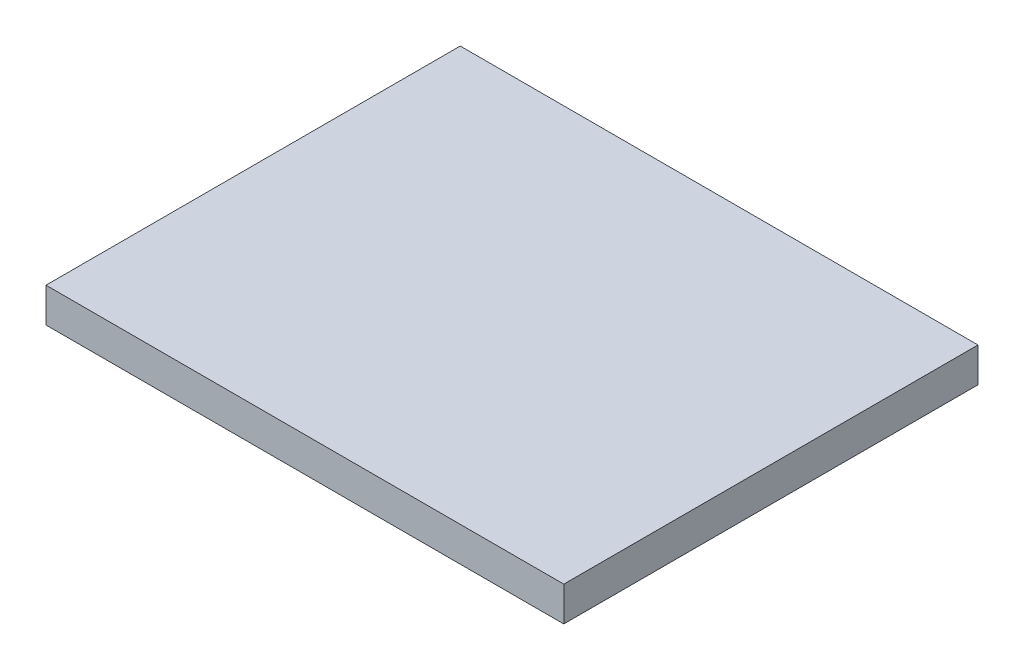
ISO-10303-21;
HEADER;
FILE_DESCRIPTION(('STEP AP214'),'2;1');
FILE_NAME('part.step','',(''),(''),'','','');
FILE_SCHEMA(('AUTOMOTIVE_DESIGN { 1 0 10303 214 1 1 1 1 }'));
ENDSEC;
DATA;
#1=APPLICATION_CONTEXT('core data for automotive mechanical design processes');
#2=APPLICATION_PROTOCOL_DEFINITION('international standard','automotive_design',2000,#1);
#3=PRODUCT_CONTEXT('',#1,'mechanical');
#4=PRODUCT('Part','Part','',(#3));
#5=PRODUCT_RELATED_PRODUCT_CATEGORY('part','',(#4));
#6=PRODUCT_DEFINITION_FORMATION('','',#4);
#7=PRODUCT_DEFINITION_CONTEXT('part definition',#1,'design');
#8=PRODUCT_DEFINITION('design','',#6,#7);
#9=PRODUCT_DEFINITION_SHAPE('','',#8);
#10=(LENGTH_UNIT() NAMED_UNIT(*) SI_UNIT(.MILLI.,.METRE.));
#11=(NAMED_UNIT(*) PLANE_ANGLE_UNIT() SI_UNIT($,.RADIAN.));
#12=(NAMED_UNIT(*) SI_UNIT($,.STERADIAN.) SOLID_ANGLE_UNIT());
#13=UNCERTAINTY_MEASURE_WITH_UNIT(LENGTH_MEASURE(1.E-05),#10,'distance_accuracy_value','');
#14=(GEOMETRIC_REPRESENTATION_CONTEXT(3) GLOBAL_UNCERTAINTY_ASSIGNED_CONTEXT((#13)) GLOBAL_UNIT_ASSIGNED_CONTEXT((#10,
#11,#12)) REPRESENTATION_CONTEXT('',''));
#15=CARTESIAN_POINT('',(0.,0.,0.));
#16=DIRECTION('',(0.,0.,1.));
#17=DIRECTION('',(1.,0.,0.));
#18=AXIS2_PLACEMENT_3D('',#15,#16,#17);
#19=CARTESIAN_POINT('',(47.625,3.175,-38.1));
#20=DIRECTION('',(-1.,0.,0.));
#21=DIRECTION('',(0.,0.,1.));
#22=AXIS2_PLACEMENT_3D('',#19,#20,#21);
#23=PLANE('',#22);
#24=DIRECTION('',(0.,0.,-1.));
#25=VECTOR('',#24,1.);
#26=CARTESIAN_POINT('',(47.625,-3.175,-38.1));
#27=LINE('',#26,#25);
#28=CARTESIAN_POINT('',(47.625,-3.175,38.1));
#29=VERTEX_POINT('',#28);
#30=CARTESIAN_POINT('',(47.625,-3.175,-38.1));
#31=VERTEX_POINT('',#30);
#32=EDGE_CURVE('E96',#29,#31,#27,.T.);
#33=ORIENTED_EDGE('',*,*,#32,.T.);
#34=DIRECTION('',(0.,-1.,0.));
#35=VECTOR('',#34,1.);
#36=CARTESIAN_POINT('',(47.625,3.175,-38.1));
#37=LINE('',#36,#35);
#38=CARTESIAN_POINT('',(47.625,3.175,-38.1));
#39=VERTEX_POINT('',#38);
#40=EDGE_CURVE('E11',#39,#31,#37,.T.);
#41=ORIENTED_EDGE('',*,*,#40,.F.);
#42=DIRECTION('',(0.,0.,-1.));
#43=VECTOR('',#42,1.);
#44=CARTESIAN_POINT('',(47.625,3.175,-38.1));
#45=LINE('',#44,#43);
#46=CARTESIAN_POINT('',(47.625,3.175,38.1));
#47=VERTEX_POINT('',#46);
#48=EDGE_CURVE('E84',#47,#39,#45,.T.);
#49=ORIENTED_EDGE('',*,*,#48,.F.);
#50=DIRECTION('',(0.,-1.,0.));
#51=VECTOR('',#50,1.);
#52=CARTESIAN_POINT('',(47.625,3.175,38.1));
#53=LINE('',#52,#51);
#54=EDGE_CURVE('E92',#47,#29,#53,.T.);
#55=ORIENTED_EDGE('',*,*,#54,.T.);
#56=EDGE_LOOP('',(#33,#41,#49,#55));
#57=FACE_BOUND('',#56,.T.);
#58=ADVANCED_FACE('F33',(#57),#23,.F.);
#59=CARTESIAN_POINT('',(-47.625,3.175,-38.1));
#60=DIRECTION('',(0.,0.,1.));
#61=DIRECTION('',(1.,0.,0.));
#62=AXIS2_PLACEMENT_3D('',#59,#60,#61);
#63=PLANE('',#62);
#64=DIRECTION('',(-1.,0.,0.));
#65=VECTOR('',#64,1.);
#66=CARTESIAN_POINT('',(-47.625,-3.175,-38.1));
#67=LINE('',#66,#65);
#68=CARTESIAN_POINT('',(-47.625,-3.175,-38.1));
#69=VERTEX_POINT('',#68);
#70=EDGE_CURVE('E88',#31,#69,#67,.T.);
#71=ORIENTED_EDGE('',*,*,#70,.T.);
#72=DIRECTION('',(0.,-1.,0.));
#73=VECTOR('',#72,1.);
#74=CARTESIAN_POINT('',(-47.625,3.175,-38.1));
#75=LINE('',#74,#73);
#76=CARTESIAN_POINT('',(-47.625,3.175,-38.1));
#77=VERTEX_POINT('',#76);
#78=EDGE_CURVE('E41',#77,#69,#75,.T.);
#79=ORIENTED_EDGE('',*,*,#78,.F.);
#80=DIRECTION('',(-1.,0.,0.));
#81=VECTOR('',#80,1.);
#82=CARTESIAN_POINT('',(-47.625,3.175,-38.1));
#83=LINE('',#82,#81);
#84=EDGE_CURVE('E79',#39,#77,#83,.T.);
#85=ORIENTED_EDGE('',*,*,#84,.F.);
#86=ORIENTED_EDGE('',*,*,#40,.T.);
#87=EDGE_LOOP('',(#71,#79,#85,#86));
#88=FACE_BOUND('',#87,.T.);
#89=ADVANCED_FACE('F87',(#88),#63,.F.);
#90=CARTESIAN_POINT('',(-47.625,3.175,-38.1));
#91=DIRECTION('',(1.,0.,0.));
#92=DIRECTION('',(0.,0.,-1.));
#93=AXIS2_PLACEMENT_3D('',#90,#91,#92);
#94=PLANE('',#93);
#95=DIRECTION('',(0.,0.,1.));
#96=VECTOR('',#95,1.);
#97=CARTESIAN_POINT('',(-47.625,-3.175,-38.1));
#98=LINE('',#97,#96);
#99=CARTESIAN_POINT('',(-47.625,-3.175,38.1));
#100=VERTEX_POINT('',#99);
#101=EDGE_CURVE('E66',#69,#100,#98,.T.);
#102=ORIENTED_EDGE('',*,*,#101,.T.);
#103=DIRECTION('',(0.,-1.,0.));
#104=VECTOR('',#103,1.);
#105=CARTESIAN_POINT('',(-47.625,3.175,38.1));
#106=LINE('',#105,#104);
#107=CARTESIAN_POINT('',(-47.625,3.175,38.1));
#108=VERTEX_POINT('',#107);
#109=EDGE_CURVE('E89',#108,#100,#106,.T.);
#110=ORIENTED_EDGE('',*,*,#109,.F.);
#111=DIRECTION('',(0.,0.,1.));
#112=VECTOR('',#111,1.);
#113=CARTESIAN_POINT('',(-47.625,3.175,-38.1));
#114=LINE('',#113,#112);
#115=EDGE_CURVE('E82',#77,#108,#114,.T.);
#116=ORIENTED_EDGE('',*,*,#115,.F.);
#117=ORIENTED_EDGE('',*,*,#78,.T.);
#118=EDGE_LOOP('',(#102,#110,#116,#117));
#119=FACE_BOUND('',#118,.T.);
#120=ADVANCED_FACE('F90',(#119),#94,.F.);
#121=CARTESIAN_POINT('',(-47.625,3.175,38.1));
#122=DIRECTION('',(0.,0.,-1.));
#123=DIRECTION('',(-1.,0.,0.));
#124=AXIS2_PLACEMENT_3D('',#121,#122,#123);
#125=PLANE('',#124);
#126=DIRECTION('',(1.,0.,0.));
#127=VECTOR('',#126,1.);
#128=CARTESIAN_POINT('',(-47.625,-3.175,38.1));
#129=LINE('',#128,#127);
#130=EDGE_CURVE('E72',#100,#29,#129,.T.);
#131=ORIENTED_EDGE('',*,*,#130,.T.);
#132=ORIENTED_EDGE('',*,*,#54,.F.);
#133=DIRECTION('',(1.,0.,0.));
#134=VECTOR('',#133,1.);
#135=CARTESIAN_POINT('',(-47.625,3.175,38.1));
#136=LINE('',#135,#134);
#137=EDGE_CURVE('E49',#108,#47,#136,.T.);
#138=ORIENTED_EDGE('',*,*,#137,.F.);
#139=ORIENTED_EDGE('',*,*,#109,.T.);
#140=EDGE_LOOP('',(#131,#132,#138,#139));
#141=FACE_BOUND('',#140,.T.);
#142=ADVANCED_FACE('F103',(#141),#125,.F.);
#143=CARTESIAN_POINT('',(0.,3.175,0.));
#144=DIRECTION('',(0.,1.,0.));
#145=DIRECTION('',(0.,0.,1.));
#146=AXIS2_PLACEMENT_3D('',#143,#144,#145);
#147=PLANE('',#146);
#148=ORIENTED_EDGE('',*,*,#48,.T.);
#149=ORIENTED_EDGE('',*,*,#84,.T.);
#150=ORIENTED_EDGE('',*,*,#115,.T.);
#151=ORIENTED_EDGE('',*,*,#137,.T.);
#152=EDGE_LOOP('',(#148,#149,#150,#151));
#153=FACE_BOUND('',#152,.T.);
#154=ADVANCED_FACE('F80',(#153),#147,.T.);
#155=CARTESIAN_POINT('',(0.,-3.175,0.));
#156=DIRECTION('',(0.,1.,0.));
#157=DIRECTION('',(0.,0.,1.));
#158=AXIS2_PLACEMENT_3D('',#155,#156,#157);
#159=PLANE('',#158);
#160=ORIENTED_EDGE('',*,*,#32,.F.);
#161=ORIENTED_EDGE('',*,*,#130,.F.);
#162=ORIENTED_EDGE('',*,*,#101,.F.);
#163=ORIENTED_EDGE('',*,*,#70,.F.);
#164=EDGE_LOOP('',(#160,#161,#162,#163));
#165=FACE_BOUND('',#164,.T.);
#166=ADVANCED_FACE('F106',(#165),#159,.F.);
#167=CLOSED_SHELL('',(#58,#89,#120,#142,#154,#166));
#168=MANIFOLD_SOLID_BREP('B2',#167);
#169=ADVANCED_BREP_SHAPE_REPRESENTATION('',(#18,#168),#14);
#170=SHAPE_DEFINITION_REPRESENTATION(#9,#169);
ENDSEC;
END-ISO-10303-21;
